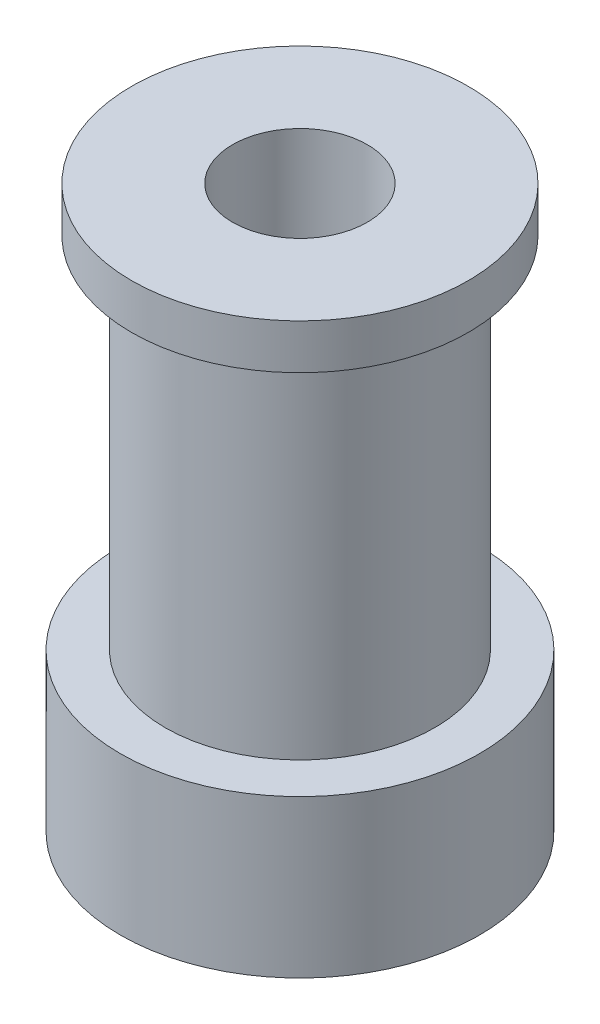
ISO-10303-21;
HEADER;
FILE_DESCRIPTION(('STEP AP214'),'2;1');
FILE_NAME('part.step','',(''),(''),'','','');
FILE_SCHEMA(('AUTOMOTIVE_DESIGN { 1 0 10303 214 1 1 1 1 }'));
ENDSEC;
DATA;
#1=APPLICATION_CONTEXT('core data for automotive mechanical design processes');
#2=APPLICATION_PROTOCOL_DEFINITION('international standard','automotive_design',2000,#1);
#3=PRODUCT_CONTEXT('',#1,'mechanical');
#4=PRODUCT('Part','Part','',(#3));
#5=PRODUCT_RELATED_PRODUCT_CATEGORY('part','',(#4));
#6=PRODUCT_DEFINITION_FORMATION('','',#4);
#7=PRODUCT_DEFINITION_CONTEXT('part definition',#1,'design');
#8=PRODUCT_DEFINITION('design','',#6,#7);
#9=PRODUCT_DEFINITION_SHAPE('','',#8);
#10=(LENGTH_UNIT() NAMED_UNIT(*) SI_UNIT(.MILLI.,.METRE.));
#11=(NAMED_UNIT(*) PLANE_ANGLE_UNIT() SI_UNIT($,.RADIAN.));
#12=(NAMED_UNIT(*) SI_UNIT($,.STERADIAN.) SOLID_ANGLE_UNIT());
#13=UNCERTAINTY_MEASURE_WITH_UNIT(LENGTH_MEASURE(1.E-05),#10,'distance_accuracy_value','');
#14=(GEOMETRIC_REPRESENTATION_CONTEXT(3) GLOBAL_UNCERTAINTY_ASSIGNED_CONTEXT((#13)) GLOBAL_UNIT_ASSIGNED_CONTEXT((#10,
#11,#12)) REPRESENTATION_CONTEXT('',''));
#15=CARTESIAN_POINT('',(0.,0.,0.));
#16=DIRECTION('',(0.,0.,1.));
#17=DIRECTION('',(1.,0.,0.));
#18=AXIS2_PLACEMENT_3D('',#15,#16,#17);
#19=CARTESIAN_POINT('',(0.,-5.,0.));
#20=DIRECTION('',(0.,1.,0.));
#21=DIRECTION('',(0.,0.,1.));
#22=AXIS2_PLACEMENT_3D('',#19,#20,#21);
#23=CYLINDRICAL_SURFACE('',#22,8.);
#24=CARTESIAN_POINT('',(0.,-5.,0.));
#25=DIRECTION('',(0.,1.,0.));
#26=DIRECTION('',(0.,0.,1.));
#27=AXIS2_PLACEMENT_3D('',#24,#25,#26);
#28=CIRCLE('',#27,8.);
#29=CARTESIAN_POINT('',(0.,-5.,8.));
#30=VERTEX_POINT('',#29);
#31=EDGE_CURVE('E42',#30,#30,#28,.T.);
#32=ORIENTED_EDGE('',*,*,#31,.T.);
#33=EDGE_LOOP('',(#32));
#34=FACE_BOUND('',#33,.T.);
#35=CARTESIAN_POINT('',(0.,2.,0.));
#36=DIRECTION('',(0.,1.,0.));
#37=DIRECTION('',(0.,0.,1.));
#38=AXIS2_PLACEMENT_3D('',#35,#36,#37);
#39=CIRCLE('',#38,8.);
#40=CARTESIAN_POINT('',(0.,2.,8.));
#41=VERTEX_POINT('',#40);
#42=EDGE_CURVE('E50',#41,#41,#39,.T.);
#43=ORIENTED_EDGE('',*,*,#42,.F.);
#44=EDGE_LOOP('',(#43));
#45=FACE_BOUND('',#44,.T.);
#46=ADVANCED_FACE('F39',(#34,#45),#23,.T.);
#47=CARTESIAN_POINT('',(0.,-5.,0.));
#48=DIRECTION('',(0.,1.,0.));
#49=DIRECTION('',(0.,0.,1.));
#50=AXIS2_PLACEMENT_3D('',#47,#48,#49);
#51=PLANE('',#50);
#52=CARTESIAN_POINT('',(0.,-5.,0.));
#53=DIRECTION('',(0.,1.,0.));
#54=DIRECTION('',(0.,0.,1.));
#55=AXIS2_PLACEMENT_3D('',#52,#53,#54);
#56=CIRCLE('',#55,3.);
#57=CARTESIAN_POINT('',(0.,-5.,3.));
#58=VERTEX_POINT('',#57);
#59=EDGE_CURVE('E67',#58,#58,#56,.T.);
#60=ORIENTED_EDGE('',*,*,#59,.T.);
#61=EDGE_LOOP('',(#60));
#62=FACE_BOUND('',#61,.T.);
#63=ORIENTED_EDGE('',*,*,#31,.F.);
#64=EDGE_LOOP('',(#63));
#65=FACE_BOUND('',#64,.T.);
#66=ADVANCED_FACE('F93',(#62,#65),#51,.F.);
#67=CARTESIAN_POINT('',(0.,2.,0.));
#68=DIRECTION('',(0.,1.,0.));
#69=DIRECTION('',(0.,0.,1.));
#70=AXIS2_PLACEMENT_3D('',#67,#68,#69);
#71=PLANE('',#70);
#72=CARTESIAN_POINT('',(0.,2.,0.));
#73=DIRECTION('',(0.,1.,0.));
#74=DIRECTION('',(0.,0.,1.));
#75=AXIS2_PLACEMENT_3D('',#72,#73,#74);
#76=CIRCLE('',#75,6.);
#77=CARTESIAN_POINT('',(0.,2.,6.));
#78=VERTEX_POINT('',#77);
#79=EDGE_CURVE('E10',#78,#78,#76,.T.);
#80=ORIENTED_EDGE('',*,*,#79,.F.);
#81=EDGE_LOOP('',(#80));
#82=FACE_BOUND('',#81,.T.);
#83=ORIENTED_EDGE('',*,*,#42,.T.);
#84=EDGE_LOOP('',(#83));
#85=FACE_BOUND('',#84,.T.);
#86=ADVANCED_FACE('F98',(#82,#85),#71,.T.);
#87=CARTESIAN_POINT('',(0.,18.,0.));
#88=DIRECTION('',(0.,-1.,0.));
#89=DIRECTION('',(0.,0.,-1.));
#90=AXIS2_PLACEMENT_3D('',#87,#88,#89);
#91=CYLINDRICAL_SURFACE('',#90,6.);
#92=CARTESIAN_POINT('',(0.,18.,0.));
#93=DIRECTION('',(0.,1.,0.));
#94=DIRECTION('',(0.,0.,1.));
#95=AXIS2_PLACEMENT_3D('',#92,#93,#94);
#96=CIRCLE('',#95,6.);
#97=CARTESIAN_POINT('',(0.,18.,6.));
#98=VERTEX_POINT('',#97);
#99=EDGE_CURVE('E52',#98,#98,#96,.T.);
#100=ORIENTED_EDGE('',*,*,#99,.F.);
#101=EDGE_LOOP('',(#100));
#102=FACE_BOUND('',#101,.T.);
#103=ORIENTED_EDGE('',*,*,#79,.T.);
#104=EDGE_LOOP('',(#103));
#105=FACE_BOUND('',#104,.T.);
#106=ADVANCED_FACE('F88',(#102,#105),#91,.T.);
#107=CARTESIAN_POINT('',(0.,20.,0.));
#108=DIRECTION('',(0.,-1.,0.));
#109=DIRECTION('',(0.,0.,-1.));
#110=AXIS2_PLACEMENT_3D('',#107,#108,#109);
#111=CYLINDRICAL_SURFACE('',#110,7.5);
#112=CARTESIAN_POINT('',(0.,20.,0.));
#113=DIRECTION('',(0.,1.,0.));
#114=DIRECTION('',(0.,0.,1.));
#115=AXIS2_PLACEMENT_3D('',#112,#113,#114);
#116=CIRCLE('',#115,7.5);
#117=CARTESIAN_POINT('',(0.,20.,7.5));
#118=VERTEX_POINT('',#117);
#119=EDGE_CURVE('E58',#118,#118,#116,.T.);
#120=ORIENTED_EDGE('',*,*,#119,.F.);
#121=EDGE_LOOP('',(#120));
#122=FACE_BOUND('',#121,.T.);
#123=CARTESIAN_POINT('',(0.,18.,0.));
#124=DIRECTION('',(0.,1.,0.));
#125=DIRECTION('',(0.,0.,1.));
#126=AXIS2_PLACEMENT_3D('',#123,#124,#125);
#127=CIRCLE('',#126,7.5);
#128=CARTESIAN_POINT('',(0.,18.,7.5));
#129=VERTEX_POINT('',#128);
#130=EDGE_CURVE('E62',#129,#129,#127,.T.);
#131=ORIENTED_EDGE('',*,*,#130,.T.);
#132=EDGE_LOOP('',(#131));
#133=FACE_BOUND('',#132,.T.);
#134=ADVANCED_FACE('F81',(#122,#133),#111,.T.);
#135=CARTESIAN_POINT('',(0.,20.,0.));
#136=DIRECTION('',(0.,1.,0.));
#137=DIRECTION('',(0.,0.,1.));
#138=AXIS2_PLACEMENT_3D('',#135,#136,#137);
#139=PLANE('',#138);
#140=CARTESIAN_POINT('',(0.,20.,0.));
#141=DIRECTION('',(0.,1.,0.));
#142=DIRECTION('',(0.,0.,1.));
#143=AXIS2_PLACEMENT_3D('',#140,#141,#142);
#144=CIRCLE('',#143,3.);
#145=CARTESIAN_POINT('',(0.,20.,3.));
#146=VERTEX_POINT('',#145);
#147=EDGE_CURVE('E71',#146,#146,#144,.T.);
#148=ORIENTED_EDGE('',*,*,#147,.F.);
#149=EDGE_LOOP('',(#148));
#150=FACE_BOUND('',#149,.T.);
#151=ORIENTED_EDGE('',*,*,#119,.T.);
#152=EDGE_LOOP('',(#151));
#153=FACE_BOUND('',#152,.T.);
#154=ADVANCED_FACE('F78',(#150,#153),#139,.T.);
#155=CARTESIAN_POINT('',(0.,18.,0.));
#156=DIRECTION('',(0.,1.,0.));
#157=DIRECTION('',(0.,0.,1.));
#158=AXIS2_PLACEMENT_3D('',#155,#156,#157);
#159=PLANE('',#158);
#160=ORIENTED_EDGE('',*,*,#99,.T.);
#161=EDGE_LOOP('',(#160));
#162=FACE_BOUND('',#161,.T.);
#163=ORIENTED_EDGE('',*,*,#130,.F.);
#164=EDGE_LOOP('',(#163));
#165=FACE_BOUND('',#164,.T.);
#166=ADVANCED_FACE('F80',(#162,#165),#159,.F.);
#167=CARTESIAN_POINT('',(0.,-14.,0.));
#168=DIRECTION('',(0.,1.,0.));
#169=DIRECTION('',(0.,0.,1.));
#170=AXIS2_PLACEMENT_3D('',#167,#168,#169);
#171=CYLINDRICAL_SURFACE('',#170,3.);
#172=ORIENTED_EDGE('',*,*,#147,.T.);
#173=EDGE_LOOP('',(#172));
#174=FACE_BOUND('',#173,.T.);
#175=ORIENTED_EDGE('',*,*,#59,.F.);
#176=EDGE_LOOP('',(#175));
#177=FACE_BOUND('',#176,.T.);
#178=ADVANCED_FACE('F75',(#174,#177),#171,.F.);
#179=CLOSED_SHELL('',(#46,#66,#86,#106,#134,#154,#166,#178));
#180=MANIFOLD_SOLID_BREP('B2',#179);
#181=ADVANCED_BREP_SHAPE_REPRESENTATION('',(#18,#180),#14);
#182=SHAPE_DEFINITION_REPRESENTATION(#9,#181);
ENDSEC;
END-ISO-10303-21;
